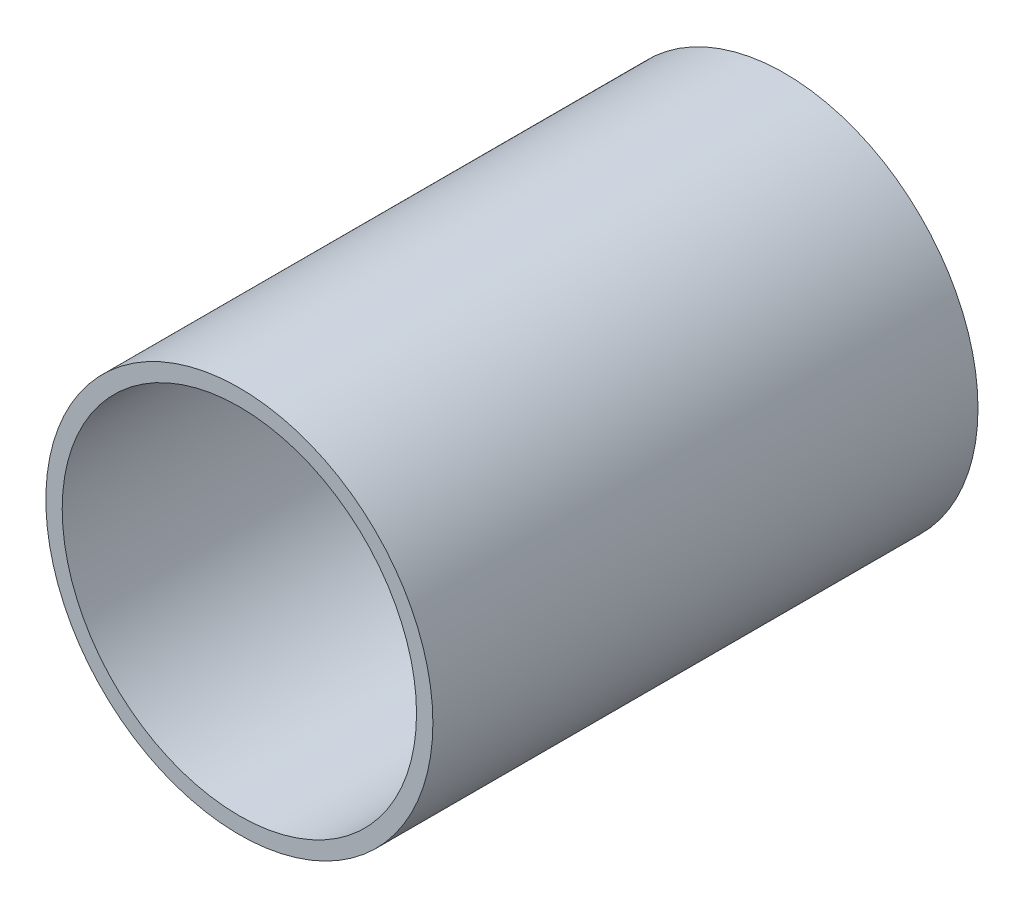
ISO-10303-21;
HEADER;
FILE_DESCRIPTION(('STEP AP214'),'2;1');
FILE_NAME('part.step','',(''),(''),'','','');
FILE_SCHEMA(('AUTOMOTIVE_DESIGN { 1 0 10303 214 1 1 1 1 }'));
ENDSEC;
DATA;
#1=APPLICATION_CONTEXT('core data for automotive mechanical design processes');
#2=APPLICATION_PROTOCOL_DEFINITION('international standard','automotive_design',2000,#1);
#3=PRODUCT_CONTEXT('',#1,'mechanical');
#4=PRODUCT('Part','Part','',(#3));
#5=PRODUCT_RELATED_PRODUCT_CATEGORY('part','',(#4));
#6=PRODUCT_DEFINITION_FORMATION('','',#4);
#7=PRODUCT_DEFINITION_CONTEXT('part definition',#1,'design');
#8=PRODUCT_DEFINITION('design','',#6,#7);
#9=PRODUCT_DEFINITION_SHAPE('','',#8);
#10=(LENGTH_UNIT() NAMED_UNIT(*) SI_UNIT(.MILLI.,.METRE.));
#11=(NAMED_UNIT(*) PLANE_ANGLE_UNIT() SI_UNIT($,.RADIAN.));
#12=(NAMED_UNIT(*) SI_UNIT($,.STERADIAN.) SOLID_ANGLE_UNIT());
#13=UNCERTAINTY_MEASURE_WITH_UNIT(LENGTH_MEASURE(1.E-05),#10,'distance_accuracy_value','');
#14=(GEOMETRIC_REPRESENTATION_CONTEXT(3) GLOBAL_UNCERTAINTY_ASSIGNED_CONTEXT((#13)) GLOBAL_UNIT_ASSIGNED_CONTEXT((#10,
#11,#12)) REPRESENTATION_CONTEXT('',''));
#15=CARTESIAN_POINT('',(0.,0.,0.));
#16=DIRECTION('',(0.,0.,1.));
#17=DIRECTION('',(1.,0.,0.));
#18=AXIS2_PLACEMENT_3D('',#15,#16,#17);
#19=CARTESIAN_POINT('',(0.,0.,100.));
#20=DIRECTION('',(0.,0.,1.));
#21=DIRECTION('',(1.,0.,0.));
#22=AXIS2_PLACEMENT_3D('',#19,#20,#21);
#23=PLANE('',#22);
#24=CARTESIAN_POINT('',(0.,0.,100.));
#25=DIRECTION('',(0.,0.,1.));
#26=DIRECTION('',(1.,0.,0.));
#27=AXIS2_PLACEMENT_3D('',#24,#25,#26);
#28=CIRCLE('',#27,35.5);
#29=CARTESIAN_POINT('',(35.5,0.,100.));
#30=VERTEX_POINT('',#29);
#31=EDGE_CURVE('E10',#30,#30,#28,.T.);
#32=ORIENTED_EDGE('',*,*,#31,.T.);
#33=EDGE_LOOP('',(#32));
#34=FACE_BOUND('',#33,.T.);
#35=CARTESIAN_POINT('',(0.,0.,100.));
#36=DIRECTION('',(0.,0.,1.));
#37=DIRECTION('',(1.,0.,0.));
#38=AXIS2_PLACEMENT_3D('',#35,#36,#37);
#39=CIRCLE('',#38,32.5);
#40=CARTESIAN_POINT('',(32.5,0.,100.));
#41=VERTEX_POINT('',#40);
#42=EDGE_CURVE('E44',#41,#41,#39,.T.);
#43=ORIENTED_EDGE('',*,*,#42,.F.);
#44=EDGE_LOOP('',(#43));
#45=FACE_BOUND('',#44,.T.);
#46=ADVANCED_FACE('F33',(#34,#45),#23,.T.);
#47=CARTESIAN_POINT('',(0.,0.,0.));
#48=DIRECTION('',(0.,0.,1.));
#49=DIRECTION('',(1.,0.,0.));
#50=AXIS2_PLACEMENT_3D('',#47,#48,#49);
#51=PLANE('',#50);
#52=CARTESIAN_POINT('',(0.,0.,0.));
#53=DIRECTION('',(0.,0.,1.));
#54=DIRECTION('',(1.,0.,0.));
#55=AXIS2_PLACEMENT_3D('',#52,#53,#54);
#56=CIRCLE('',#55,35.5);
#57=CARTESIAN_POINT('',(35.5,0.,0.));
#58=VERTEX_POINT('',#57);
#59=EDGE_CURVE('E37',#58,#58,#56,.T.);
#60=ORIENTED_EDGE('',*,*,#59,.F.);
#61=EDGE_LOOP('',(#60));
#62=FACE_BOUND('',#61,.T.);
#63=CARTESIAN_POINT('',(0.,0.,0.));
#64=DIRECTION('',(0.,0.,1.));
#65=DIRECTION('',(1.,0.,0.));
#66=AXIS2_PLACEMENT_3D('',#63,#64,#65);
#67=CIRCLE('',#66,32.5);
#68=CARTESIAN_POINT('',(32.5,0.,0.));
#69=VERTEX_POINT('',#68);
#70=EDGE_CURVE('E46',#69,#69,#67,.T.);
#71=ORIENTED_EDGE('',*,*,#70,.T.);
#72=EDGE_LOOP('',(#71));
#73=FACE_BOUND('',#72,.T.);
#74=ADVANCED_FACE('F56',(#62,#73),#51,.F.);
#75=CARTESIAN_POINT('',(0.,0.,100.));
#76=DIRECTION('',(0.,0.,-1.));
#77=DIRECTION('',(-1.,0.,0.));
#78=AXIS2_PLACEMENT_3D('',#75,#76,#77);
#79=CYLINDRICAL_SURFACE('',#78,35.5);
#80=ORIENTED_EDGE('',*,*,#31,.F.);
#81=EDGE_LOOP('',(#80));
#82=FACE_BOUND('',#81,.T.);
#83=ORIENTED_EDGE('',*,*,#59,.T.);
#84=EDGE_LOOP('',(#83));
#85=FACE_BOUND('',#84,.T.);
#86=ADVANCED_FACE('F35',(#82,#85),#79,.T.);
#87=CARTESIAN_POINT('',(0.,0.,100.));
#88=DIRECTION('',(0.,0.,-1.));
#89=DIRECTION('',(-1.,0.,0.));
#90=AXIS2_PLACEMENT_3D('',#87,#88,#89);
#91=CYLINDRICAL_SURFACE('',#90,32.5);
#92=ORIENTED_EDGE('',*,*,#42,.T.);
#93=EDGE_LOOP('',(#92));
#94=FACE_BOUND('',#93,.T.);
#95=ORIENTED_EDGE('',*,*,#70,.F.);
#96=EDGE_LOOP('',(#95));
#97=FACE_BOUND('',#96,.T.);
#98=ADVANCED_FACE('F52',(#94,#97),#91,.F.);
#99=CLOSED_SHELL('',(#46,#74,#86,#98));
#100=MANIFOLD_SOLID_BREP('B2',#99);
#101=ADVANCED_BREP_SHAPE_REPRESENTATION('',(#18,#100),#14);
#102=SHAPE_DEFINITION_REPRESENTATION(#9,#101);
ENDSEC;
END-ISO-10303-21;
